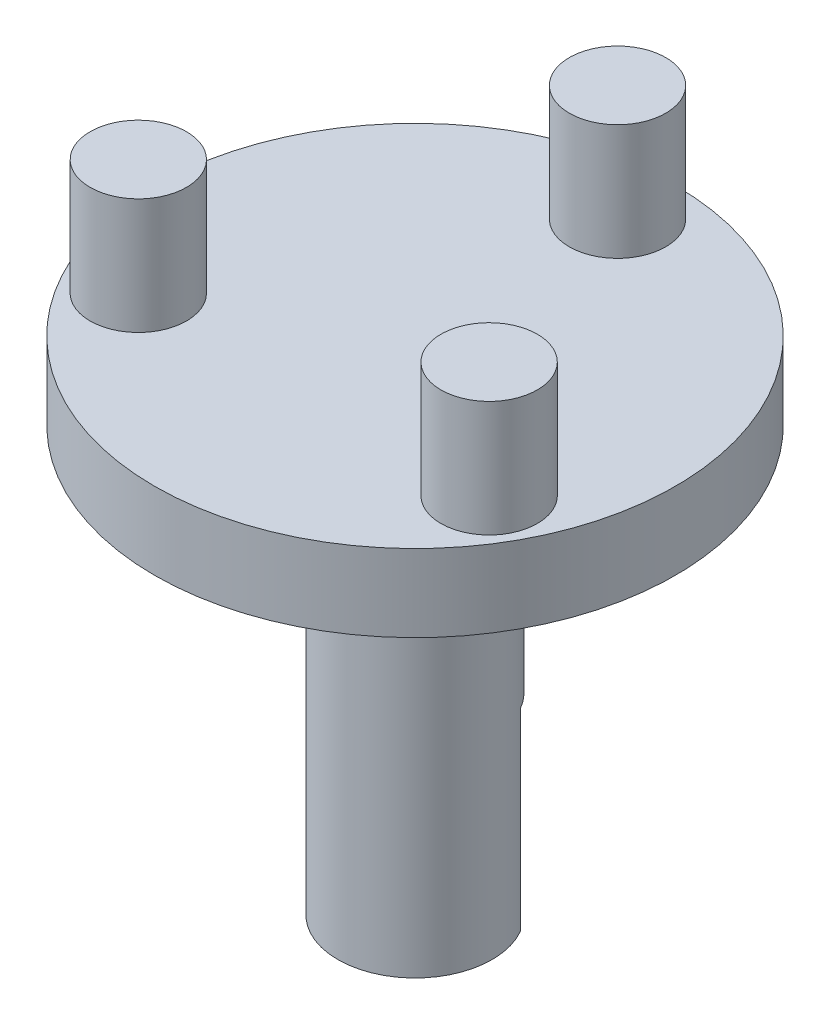
ISO-10303-21;
HEADER;
FILE_DESCRIPTION(('STEP AP214'),'2;1');
FILE_NAME('part.step','',(''),(''),'','','');
FILE_SCHEMA(('AUTOMOTIVE_DESIGN { 1 0 10303 214 1 1 1 1 }'));
ENDSEC;
DATA;
#1=APPLICATION_CONTEXT('core data for automotive mechanical design processes');
#2=APPLICATION_PROTOCOL_DEFINITION('international standard','automotive_design',2000,#1);
#3=PRODUCT_CONTEXT('',#1,'mechanical');
#4=PRODUCT('Part','Part','',(#3));
#5=PRODUCT_RELATED_PRODUCT_CATEGORY('part','',(#4));
#6=PRODUCT_DEFINITION_FORMATION('','',#4);
#7=PRODUCT_DEFINITION_CONTEXT('part definition',#1,'design');
#8=PRODUCT_DEFINITION('design','',#6,#7);
#9=PRODUCT_DEFINITION_SHAPE('','',#8);
#10=(LENGTH_UNIT() NAMED_UNIT(*) SI_UNIT(.MILLI.,.METRE.));
#11=(NAMED_UNIT(*) PLANE_ANGLE_UNIT() SI_UNIT($,.RADIAN.));
#12=(NAMED_UNIT(*) SI_UNIT($,.STERADIAN.) SOLID_ANGLE_UNIT());
#13=UNCERTAINTY_MEASURE_WITH_UNIT(LENGTH_MEASURE(1.E-05),#10,'distance_accuracy_value','');
#14=(GEOMETRIC_REPRESENTATION_CONTEXT(3) GLOBAL_UNCERTAINTY_ASSIGNED_CONTEXT((#13)) GLOBAL_UNIT_ASSIGNED_CONTEXT((#10,
#11,#12)) REPRESENTATION_CONTEXT('',''));
#15=CARTESIAN_POINT('',(0.,0.,0.));
#16=DIRECTION('',(0.,0.,1.));
#17=DIRECTION('',(1.,0.,0.));
#18=AXIS2_PLACEMENT_3D('',#15,#16,#17);
#19=CARTESIAN_POINT('',(0.,4.,0.));
#20=DIRECTION('',(0.,-1.,0.));
#21=DIRECTION('',(0.,0.,-1.));
#22=AXIS2_PLACEMENT_3D('',#19,#20,#21);
#23=CYLINDRICAL_SURFACE('',#22,13.5);
#24=CARTESIAN_POINT('',(0.,4.,0.));
#25=DIRECTION('',(0.,1.,0.));
#26=DIRECTION('',(0.,0.,1.));
#27=AXIS2_PLACEMENT_3D('',#24,#25,#26);
#28=CIRCLE('',#27,13.5);
#29=CARTESIAN_POINT('',(0.,4.,13.5));
#30=VERTEX_POINT('',#29);
#31=EDGE_CURVE('E46',#30,#30,#28,.T.);
#32=ORIENTED_EDGE('',*,*,#31,.F.);
#33=EDGE_LOOP('',(#32));
#34=FACE_BOUND('',#33,.T.);
#35=CARTESIAN_POINT('',(0.,0.,0.));
#36=DIRECTION('',(0.,1.,0.));
#37=DIRECTION('',(0.,0.,1.));
#38=AXIS2_PLACEMENT_3D('',#35,#36,#37);
#39=CIRCLE('',#38,13.5);
#40=CARTESIAN_POINT('',(0.,0.,13.5));
#41=VERTEX_POINT('',#40);
#42=EDGE_CURVE('E111',#41,#41,#39,.T.);
#43=ORIENTED_EDGE('',*,*,#42,.T.);
#44=EDGE_LOOP('',(#43));
#45=FACE_BOUND('',#44,.T.);
#46=ADVANCED_FACE('F38',(#34,#45),#23,.T.);
#47=CARTESIAN_POINT('',(0.,4.,0.));
#48=DIRECTION('',(0.,1.,0.));
#49=DIRECTION('',(0.,0.,1.));
#50=AXIS2_PLACEMENT_3D('',#47,#48,#49);
#51=PLANE('',#50);
#52=CARTESIAN_POINT('',(-9.09326673973594,4.,5.25000000000039));
#53=DIRECTION('',(0.,1.,0.));
#54=DIRECTION('',(0.,0.,1.));
#55=AXIS2_PLACEMENT_3D('',#52,#53,#54);
#56=CIRCLE('',#55,2.50000000000085);
#57=CARTESIAN_POINT('',(-9.09326673973594,4.,7.75000000000124));
#58=VERTEX_POINT('',#57);
#59=EDGE_CURVE('E95',#58,#58,#56,.T.);
#60=ORIENTED_EDGE('',*,*,#59,.F.);
#61=EDGE_LOOP('',(#60));
#62=FACE_BOUND('',#61,.T.);
#63=CARTESIAN_POINT('',(9.09326673973728,4.,5.24999999999961));
#64=DIRECTION('',(0.,1.,0.));
#65=DIRECTION('',(0.,0.,1.));
#66=AXIS2_PLACEMENT_3D('',#63,#64,#65);
#67=CIRCLE('',#66,2.50000000000058);
#68=CARTESIAN_POINT('',(9.09326673973728,4.,7.75000000000019));
#69=VERTEX_POINT('',#68);
#70=EDGE_CURVE('E94',#69,#69,#67,.T.);
#71=ORIENTED_EDGE('',*,*,#70,.F.);
#72=EDGE_LOOP('',(#71));
#73=FACE_BOUND('',#72,.T.);
#74=CARTESIAN_POINT('',(0.,4.,-10.5));
#75=DIRECTION('',(0.,1.,0.));
#76=DIRECTION('',(0.,0.,1.));
#77=AXIS2_PLACEMENT_3D('',#74,#75,#76);
#78=CIRCLE('',#77,2.5);
#79=CARTESIAN_POINT('',(0.,4.,-8.));
#80=VERTEX_POINT('',#79);
#81=EDGE_CURVE('E103',#80,#80,#78,.T.);
#82=ORIENTED_EDGE('',*,*,#81,.F.);
#83=EDGE_LOOP('',(#82));
#84=FACE_BOUND('',#83,.T.);
#85=ORIENTED_EDGE('',*,*,#31,.T.);
#86=EDGE_LOOP('',(#85));
#87=FACE_BOUND('',#86,.T.);
#88=ADVANCED_FACE('F141',(#62,#73,#84,#87),#51,.T.);
#89=CARTESIAN_POINT('',(0.,0.,0.));
#90=DIRECTION('',(0.,1.,0.));
#91=DIRECTION('',(0.,0.,1.));
#92=AXIS2_PLACEMENT_3D('',#89,#90,#91);
#93=PLANE('',#92);
#94=CARTESIAN_POINT('',(0.,0.,0.));
#95=DIRECTION('',(0.,1.,0.));
#96=DIRECTION('',(0.,0.,1.));
#97=AXIS2_PLACEMENT_3D('',#94,#95,#96);
#98=CIRCLE('',#97,5.5);
#99=CARTESIAN_POINT('',(0.,0.,5.5));
#100=VERTEX_POINT('',#99);
#101=EDGE_CURVE('E11',#100,#100,#98,.F.);
#102=ORIENTED_EDGE('',*,*,#101,.F.);
#103=EDGE_LOOP('',(#102));
#104=FACE_BOUND('',#103,.T.);
#105=ORIENTED_EDGE('',*,*,#42,.F.);
#106=EDGE_LOOP('',(#105));
#107=FACE_BOUND('',#106,.T.);
#108=ADVANCED_FACE('F137',(#104,#107),#93,.F.);
#109=CARTESIAN_POINT('',(0.,10.,-10.5));
#110=DIRECTION('',(0.,-1.,0.));
#111=DIRECTION('',(0.,0.,-1.));
#112=AXIS2_PLACEMENT_3D('',#109,#110,#111);
#113=CYLINDRICAL_SURFACE('',#112,2.5);
#114=CARTESIAN_POINT('',(0.,10.,-10.5));
#115=DIRECTION('',(0.,1.,0.));
#116=DIRECTION('',(0.,0.,1.));
#117=AXIS2_PLACEMENT_3D('',#114,#115,#116);
#118=CIRCLE('',#117,2.5);
#119=CARTESIAN_POINT('',(0.,10.,-8.));
#120=VERTEX_POINT('',#119);
#121=EDGE_CURVE('E107',#120,#120,#118,.T.);
#122=ORIENTED_EDGE('',*,*,#121,.F.);
#123=EDGE_LOOP('',(#122));
#124=FACE_BOUND('',#123,.T.);
#125=ORIENTED_EDGE('',*,*,#81,.T.);
#126=EDGE_LOOP('',(#125));
#127=FACE_BOUND('',#126,.T.);
#128=ADVANCED_FACE('F140',(#124,#127),#113,.T.);
#129=CARTESIAN_POINT('',(0.,10.,-10.5));
#130=DIRECTION('',(0.,1.,0.));
#131=DIRECTION('',(0.,0.,1.));
#132=AXIS2_PLACEMENT_3D('',#129,#130,#131);
#133=PLANE('',#132);
#134=ORIENTED_EDGE('',*,*,#121,.T.);
#135=EDGE_LOOP('',(#134));
#136=FACE_BOUND('',#135,.T.);
#137=ADVANCED_FACE('F160',(#136),#133,.T.);
#138=CARTESIAN_POINT('',(9.09326673973728,10.,5.24999999999961));
#139=DIRECTION('',(0.,-1.,0.));
#140=DIRECTION('',(0.,0.,-1.));
#141=AXIS2_PLACEMENT_3D('',#138,#139,#140);
#142=CYLINDRICAL_SURFACE('',#141,2.50000000000058);
#143=CARTESIAN_POINT('',(9.09326673973728,10.,5.24999999999961));
#144=DIRECTION('',(0.,1.,0.));
#145=DIRECTION('',(0.,0.,1.));
#146=AXIS2_PLACEMENT_3D('',#143,#144,#145);
#147=CIRCLE('',#146,2.50000000000058);
#148=CARTESIAN_POINT('',(9.09326673973728,10.,7.75000000000019));
#149=VERTEX_POINT('',#148);
#150=EDGE_CURVE('E99',#149,#149,#147,.T.);
#151=ORIENTED_EDGE('',*,*,#150,.F.);
#152=EDGE_LOOP('',(#151));
#153=FACE_BOUND('',#152,.T.);
#154=ORIENTED_EDGE('',*,*,#70,.T.);
#155=EDGE_LOOP('',(#154));
#156=FACE_BOUND('',#155,.T.);
#157=ADVANCED_FACE('F164',(#153,#156),#142,.T.);
#158=CARTESIAN_POINT('',(9.09326673973728,10.,5.24999999999961));
#159=DIRECTION('',(0.,1.,0.));
#160=DIRECTION('',(0.,0.,1.));
#161=AXIS2_PLACEMENT_3D('',#158,#159,#160);
#162=PLANE('',#161);
#163=ORIENTED_EDGE('',*,*,#150,.T.);
#164=EDGE_LOOP('',(#163));
#165=FACE_BOUND('',#164,.T.);
#166=ADVANCED_FACE('F168',(#165),#162,.T.);
#167=CARTESIAN_POINT('',(-9.09326673973594,10.,5.25000000000039));
#168=DIRECTION('',(0.,-1.,0.));
#169=DIRECTION('',(0.,0.,-1.));
#170=AXIS2_PLACEMENT_3D('',#167,#168,#169);
#171=CYLINDRICAL_SURFACE('',#170,2.50000000000085);
#172=CARTESIAN_POINT('',(-9.09326673973594,10.,5.25000000000039));
#173=DIRECTION('',(0.,1.,0.));
#174=DIRECTION('',(0.,0.,1.));
#175=AXIS2_PLACEMENT_3D('',#172,#173,#174);
#176=CIRCLE('',#175,2.50000000000085);
#177=CARTESIAN_POINT('',(-9.09326673973594,10.,7.75000000000124));
#178=VERTEX_POINT('',#177);
#179=EDGE_CURVE('E90',#178,#178,#176,.T.);
#180=ORIENTED_EDGE('',*,*,#179,.F.);
#181=EDGE_LOOP('',(#180));
#182=FACE_BOUND('',#181,.T.);
#183=ORIENTED_EDGE('',*,*,#59,.T.);
#184=EDGE_LOOP('',(#183));
#185=FACE_BOUND('',#184,.T.);
#186=ADVANCED_FACE('F172',(#182,#185),#171,.T.);
#187=CARTESIAN_POINT('',(-9.09326673973594,10.,5.25000000000039));
#188=DIRECTION('',(0.,1.,0.));
#189=DIRECTION('',(0.,0.,1.));
#190=AXIS2_PLACEMENT_3D('',#187,#188,#189);
#191=PLANE('',#190);
#192=ORIENTED_EDGE('',*,*,#179,.T.);
#193=EDGE_LOOP('',(#192));
#194=FACE_BOUND('',#193,.T.);
#195=ADVANCED_FACE('F133',(#194),#191,.T.);
#196=CARTESIAN_POINT('',(0.,-1.,0.));
#197=DIRECTION('',(0.,1.,0.));
#198=DIRECTION('',(0.,0.,1.));
#199=AXIS2_PLACEMENT_3D('',#196,#197,#198);
#200=CYLINDRICAL_SURFACE('',#199,5.5);
#201=CARTESIAN_POINT('',(0.,-1.,0.));
#202=DIRECTION('',(0.,-1.,0.));
#203=DIRECTION('',(0.,0.,-1.));
#204=AXIS2_PLACEMENT_3D('',#201,#202,#203);
#205=CIRCLE('',#204,5.5);
#206=CARTESIAN_POINT('',(0.,-1.,-5.5));
#207=VERTEX_POINT('',#206);
#208=EDGE_CURVE('E82',#207,#207,#205,.T.);
#209=ORIENTED_EDGE('',*,*,#208,.F.);
#210=EDGE_LOOP('',(#209));
#211=FACE_BOUND('',#210,.T.);
#212=ORIENTED_EDGE('',*,*,#101,.T.);
#213=EDGE_LOOP('',(#212));
#214=FACE_BOUND('',#213,.T.);
#215=ADVANCED_FACE('F127',(#211,#214),#200,.T.);
#216=CARTESIAN_POINT('',(0.,-1.,0.));
#217=DIRECTION('',(0.,-1.,0.));
#218=DIRECTION('',(0.,0.,-1.));
#219=AXIS2_PLACEMENT_3D('',#216,#217,#218);
#220=PLANE('',#219);
#221=CARTESIAN_POINT('',(0.,-1.,0.));
#222=DIRECTION('',(0.,-1.,0.));
#223=DIRECTION('',(0.,0.,-1.));
#224=AXIS2_PLACEMENT_3D('',#221,#222,#223);
#225=CIRCLE('',#224,4.);
#226=CARTESIAN_POINT('',(0.,-1.,-4.));
#227=VERTEX_POINT('',#226);
#228=EDGE_CURVE('E86',#227,#227,#225,.T.);
#229=ORIENTED_EDGE('',*,*,#228,.F.);
#230=EDGE_LOOP('',(#229));
#231=FACE_BOUND('',#230,.T.);
#232=ORIENTED_EDGE('',*,*,#208,.T.);
#233=EDGE_LOOP('',(#232));
#234=FACE_BOUND('',#233,.T.);
#235=ADVANCED_FACE('F124',(#231,#234),#220,.T.);
#236=CARTESIAN_POINT('',(0.,-7.,0.));
#237=DIRECTION('',(0.,1.,0.));
#238=DIRECTION('',(0.,0.,1.));
#239=AXIS2_PLACEMENT_3D('',#236,#237,#238);
#240=CYLINDRICAL_SURFACE('',#239,4.);
#241=CARTESIAN_POINT('',(0.,-22.,0.));
#242=DIRECTION('',(0.,-1.,0.));
#243=DIRECTION('',(0.,0.,-1.));
#244=AXIS2_PLACEMENT_3D('',#241,#242,#243);
#245=CIRCLE('',#244,4.);
#246=CARTESIAN_POINT('',(3.46410161513775,-22.,-2.));
#247=VERTEX_POINT('',#246);
#248=CARTESIAN_POINT('',(-3.46410161513775,-22.,-2.));
#249=VERTEX_POINT('',#248);
#250=EDGE_CURVE('E77',#247,#249,#245,.T.);
#251=ORIENTED_EDGE('',*,*,#250,.F.);
#252=DIRECTION('',(0.,-1.,0.));
#253=VECTOR('',#252,1.);
#254=CARTESIAN_POINT('',(3.46410161513775,-12.,-2.));
#255=LINE('',#254,#253);
#256=CARTESIAN_POINT('',(3.46410161513775,-12.,-2.));
#257=VERTEX_POINT('',#256);
#258=EDGE_CURVE('E53',#257,#247,#255,.T.);
#259=ORIENTED_EDGE('',*,*,#258,.F.);
#260=CARTESIAN_POINT('',(0.,-12.,0.));
#261=DIRECTION('',(0.,-1.,0.));
#262=DIRECTION('',(0.,0.,-1.));
#263=AXIS2_PLACEMENT_3D('',#260,#261,#262);
#264=CIRCLE('',#263,4.);
#265=CARTESIAN_POINT('',(-3.46410161513775,-12.,-2.));
#266=VERTEX_POINT('',#265);
#267=EDGE_CURVE('E70',#266,#257,#264,.T.);
#268=ORIENTED_EDGE('',*,*,#267,.F.);
#269=DIRECTION('',(0.,-1.,0.));
#270=VECTOR('',#269,1.);
#271=CARTESIAN_POINT('',(-3.46410161513775,-12.,-2.));
#272=LINE('',#271,#270);
#273=EDGE_CURVE('E59',#266,#249,#272,.T.);
#274=ORIENTED_EDGE('',*,*,#273,.T.);
#275=EDGE_LOOP('',(#251,#259,#268,#274));
#276=FACE_BOUND('',#275,.T.);
#277=ORIENTED_EDGE('',*,*,#228,.T.);
#278=EDGE_LOOP('',(#277));
#279=FACE_BOUND('',#278,.T.);
#280=ADVANCED_FACE('F75',(#276,#279),#240,.T.);
#281=CARTESIAN_POINT('',(0.,-22.,0.));
#282=DIRECTION('',(0.,-1.,0.));
#283=DIRECTION('',(0.,0.,-1.));
#284=AXIS2_PLACEMENT_3D('',#281,#282,#283);
#285=PLANE('',#284);
#286=DIRECTION('',(-1.,0.,0.));
#287=VECTOR('',#286,1.);
#288=CARTESIAN_POINT('',(3.46410161513775,-22.,-2.));
#289=LINE('',#288,#287);
#290=EDGE_CURVE('E64',#247,#249,#289,.T.);
#291=ORIENTED_EDGE('',*,*,#290,.F.);
#292=ORIENTED_EDGE('',*,*,#250,.T.);
#293=EDGE_LOOP('',(#291,#292));
#294=FACE_BOUND('',#293,.T.);
#295=ADVANCED_FACE('F80',(#294),#285,.T.);
#296=CARTESIAN_POINT('',(3.46410161513775,-12.,-2.));
#297=DIRECTION('',(0.,0.,1.));
#298=DIRECTION('',(1.,0.,0.));
#299=AXIS2_PLACEMENT_3D('',#296,#297,#298);
#300=PLANE('',#299);
#301=CARTESIAN_POINT('',(0.,-15.5,-2.));
#302=DIRECTION('',(0.,0.,-1.));
#303=DIRECTION('',(-1.,0.,0.));
#304=AXIS2_PLACEMENT_3D('',#301,#302,#303);
#305=CIRCLE('',#304,1.5);
#306=CARTESIAN_POINT('',(-1.5,-15.5,-2.));
#307=VERTEX_POINT('',#306);
#308=EDGE_CURVE('E203',#307,#307,#305,.T.);
#309=ORIENTED_EDGE('',*,*,#308,.F.);
#310=EDGE_LOOP('',(#309));
#311=FACE_BOUND('',#310,.T.);
#312=ORIENTED_EDGE('',*,*,#290,.T.);
#313=ORIENTED_EDGE('',*,*,#273,.F.);
#314=DIRECTION('',(-1.,0.,0.));
#315=VECTOR('',#314,1.);
#316=CARTESIAN_POINT('',(3.46410161513775,-12.,-2.));
#317=LINE('',#316,#315);
#318=EDGE_CURVE('E211',#257,#266,#317,.T.);
#319=ORIENTED_EDGE('',*,*,#318,.F.);
#320=ORIENTED_EDGE('',*,*,#258,.T.);
#321=EDGE_LOOP('',(#312,#313,#319,#320));
#322=FACE_BOUND('',#321,.T.);
#323=ADVANCED_FACE('F65',(#311,#322),#300,.F.);
#324=CARTESIAN_POINT('',(0.,-12.,0.));
#325=DIRECTION('',(0.,-1.,0.));
#326=DIRECTION('',(0.,0.,-1.));
#327=AXIS2_PLACEMENT_3D('',#324,#325,#326);
#328=PLANE('',#327);
#329=ORIENTED_EDGE('',*,*,#267,.T.);
#330=ORIENTED_EDGE('',*,*,#318,.T.);
#331=EDGE_LOOP('',(#329,#330));
#332=FACE_BOUND('',#331,.T.);
#333=ADVANCED_FACE('F186',(#332),#328,.T.);
#334=CARTESIAN_POINT('',(0.,-15.5,-1.));
#335=DIRECTION('',(0.,0.,-1.));
#336=DIRECTION('',(-1.,0.,0.));
#337=AXIS2_PLACEMENT_3D('',#334,#335,#336);
#338=CYLINDRICAL_SURFACE('',#337,1.5);
#339=CARTESIAN_POINT('',(0.,-15.5,-1.));
#340=DIRECTION('',(0.,0.,-1.));
#341=DIRECTION('',(-1.,0.,0.));
#342=AXIS2_PLACEMENT_3D('',#339,#340,#341);
#343=CIRCLE('',#342,1.5);
#344=CARTESIAN_POINT('',(-1.5,-15.5,-1.));
#345=VERTEX_POINT('',#344);
#346=EDGE_CURVE('E71',#345,#345,#343,.T.);
#347=ORIENTED_EDGE('',*,*,#346,.F.);
#348=EDGE_LOOP('',(#347));
#349=FACE_BOUND('',#348,.T.);
#350=ORIENTED_EDGE('',*,*,#308,.T.);
#351=EDGE_LOOP('',(#350));
#352=FACE_BOUND('',#351,.T.);
#353=ADVANCED_FACE('F190',(#349,#352),#338,.F.);
#354=CARTESIAN_POINT('',(0.,-15.5,-1.));
#355=DIRECTION('',(0.,0.,-1.));
#356=DIRECTION('',(-1.,0.,0.));
#357=AXIS2_PLACEMENT_3D('',#354,#355,#356);
#358=PLANE('',#357);
#359=ORIENTED_EDGE('',*,*,#346,.T.);
#360=EDGE_LOOP('',(#359));
#361=FACE_BOUND('',#360,.T.);
#362=ADVANCED_FACE('F194',(#361),#358,.T.);
#363=CLOSED_SHELL('',(#46,#88,#108,#128,#137,#157,#166,#186,#195,#215,#235,#280,#295,#323,#333,
#353,#362));
#364=MANIFOLD_SOLID_BREP('B2',#363);
#365=ADVANCED_BREP_SHAPE_REPRESENTATION('',(#18,#364),#14);
#366=SHAPE_DEFINITION_REPRESENTATION(#9,#365);
ENDSEC;
END-ISO-10303-21;
